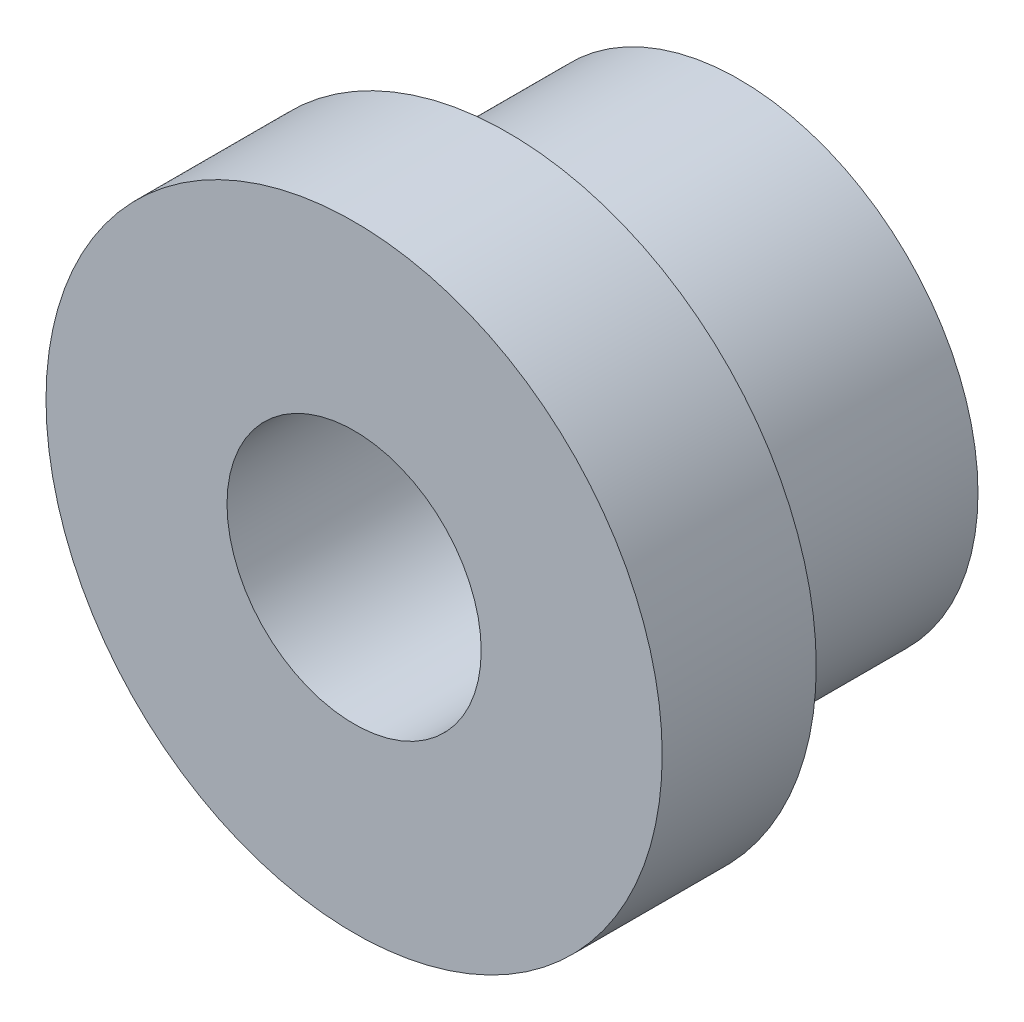
ISO-10303-21;
HEADER;
FILE_DESCRIPTION(('STEP AP214'),'2;1');
FILE_NAME('part.step','',(''),(''),'','','');
FILE_SCHEMA(('AUTOMOTIVE_DESIGN { 1 0 10303 214 1 1 1 1 }'));
ENDSEC;
DATA;
#1=APPLICATION_CONTEXT('core data for automotive mechanical design processes');
#2=APPLICATION_PROTOCOL_DEFINITION('international standard','automotive_design',2000,#1);
#3=PRODUCT_CONTEXT('',#1,'mechanical');
#4=PRODUCT('Part','Part','',(#3));
#5=PRODUCT_RELATED_PRODUCT_CATEGORY('part','',(#4));
#6=PRODUCT_DEFINITION_FORMATION('','',#4);
#7=PRODUCT_DEFINITION_CONTEXT('part definition',#1,'design');
#8=PRODUCT_DEFINITION('design','',#6,#7);
#9=PRODUCT_DEFINITION_SHAPE('','',#8);
#10=(LENGTH_UNIT() NAMED_UNIT(*) SI_UNIT(.MILLI.,.METRE.));
#11=(NAMED_UNIT(*) PLANE_ANGLE_UNIT() SI_UNIT($,.RADIAN.));
#12=(NAMED_UNIT(*) SI_UNIT($,.STERADIAN.) SOLID_ANGLE_UNIT());
#13=UNCERTAINTY_MEASURE_WITH_UNIT(LENGTH_MEASURE(1.E-05),#10,'distance_accuracy_value','');
#14=(GEOMETRIC_REPRESENTATION_CONTEXT(3) GLOBAL_UNCERTAINTY_ASSIGNED_CONTEXT((#13)) GLOBAL_UNIT_ASSIGNED_CONTEXT((#10,
#11,#12)) REPRESENTATION_CONTEXT('',''));
#15=CARTESIAN_POINT('',(0.,0.,0.));
#16=DIRECTION('',(0.,0.,1.));
#17=DIRECTION('',(1.,0.,0.));
#18=AXIS2_PLACEMENT_3D('',#15,#16,#17);
#19=CARTESIAN_POINT('',(0.,0.,0.));
#20=DIRECTION('',(0.,0.,1.));
#21=DIRECTION('',(1.,0.,0.));
#22=AXIS2_PLACEMENT_3D('',#19,#20,#21);
#23=PLANE('',#22);
#24=CARTESIAN_POINT('',(0.,0.,0.));
#25=DIRECTION('',(0.,0.,1.));
#26=DIRECTION('',(1.,0.,0.));
#27=AXIS2_PLACEMENT_3D('',#24,#25,#26);
#28=CIRCLE('',#27,3.1);
#29=CARTESIAN_POINT('',(3.1,0.,0.));
#30=VERTEX_POINT('',#29);
#31=EDGE_CURVE('E43',#30,#30,#28,.T.);
#32=ORIENTED_EDGE('',*,*,#31,.F.);
#33=EDGE_LOOP('',(#32));
#34=FACE_BOUND('',#33,.T.);
#35=CARTESIAN_POINT('',(0.,0.,0.));
#36=DIRECTION('',(0.,0.,1.));
#37=DIRECTION('',(1.,0.,0.));
#38=AXIS2_PLACEMENT_3D('',#35,#36,#37);
#39=CIRCLE('',#38,1.65);
#40=CARTESIAN_POINT('',(1.65,0.,0.));
#41=VERTEX_POINT('',#40);
#42=EDGE_CURVE('E49',#41,#41,#39,.T.);
#43=ORIENTED_EDGE('',*,*,#42,.T.);
#44=EDGE_LOOP('',(#43));
#45=FACE_BOUND('',#44,.T.);
#46=ADVANCED_FACE('F39',(#34,#45),#23,.F.);
#47=CARTESIAN_POINT('',(0.,0.,3.));
#48=DIRECTION('',(0.,0.,-1.));
#49=DIRECTION('',(-1.,0.,0.));
#50=AXIS2_PLACEMENT_3D('',#47,#48,#49);
#51=CYLINDRICAL_SURFACE('',#50,3.1);
#52=CARTESIAN_POINT('',(0.,0.,3.));
#53=DIRECTION('',(0.,0.,1.));
#54=DIRECTION('',(1.,0.,0.));
#55=AXIS2_PLACEMENT_3D('',#52,#53,#54);
#56=CIRCLE('',#55,3.1);
#57=CARTESIAN_POINT('',(3.1,0.,3.));
#58=VERTEX_POINT('',#57);
#59=EDGE_CURVE('E10',#58,#58,#56,.T.);
#60=ORIENTED_EDGE('',*,*,#59,.F.);
#61=EDGE_LOOP('',(#60));
#62=FACE_BOUND('',#61,.T.);
#63=ORIENTED_EDGE('',*,*,#31,.T.);
#64=EDGE_LOOP('',(#63));
#65=FACE_BOUND('',#64,.T.);
#66=ADVANCED_FACE('F41',(#62,#65),#51,.T.);
#67=CARTESIAN_POINT('',(0.,0.,3.));
#68=DIRECTION('',(0.,0.,-1.));
#69=DIRECTION('',(-1.,0.,0.));
#70=AXIS2_PLACEMENT_3D('',#67,#68,#69);
#71=CYLINDRICAL_SURFACE('',#70,1.65);
#72=ORIENTED_EDGE('',*,*,#42,.F.);
#73=EDGE_LOOP('',(#72));
#74=FACE_BOUND('',#73,.T.);
#75=CARTESIAN_POINT('',(0.,0.,5.));
#76=DIRECTION('',(0.,0.,1.));
#77=DIRECTION('',(1.,0.,0.));
#78=AXIS2_PLACEMENT_3D('',#75,#76,#77);
#79=CIRCLE('',#78,1.65);
#80=CARTESIAN_POINT('',(1.65,0.,5.));
#81=VERTEX_POINT('',#80);
#82=EDGE_CURVE('E59',#81,#81,#79,.T.);
#83=ORIENTED_EDGE('',*,*,#82,.T.);
#84=EDGE_LOOP('',(#83));
#85=FACE_BOUND('',#84,.T.);
#86=ADVANCED_FACE('F62',(#74,#85),#71,.F.);
#87=CARTESIAN_POINT('',(0.,0.,5.));
#88=DIRECTION('',(0.,0.,1.));
#89=DIRECTION('',(1.,0.,0.));
#90=AXIS2_PLACEMENT_3D('',#87,#88,#89);
#91=PLANE('',#90);
#92=CARTESIAN_POINT('',(0.,0.,5.));
#93=DIRECTION('',(0.,0.,1.));
#94=DIRECTION('',(1.,0.,0.));
#95=AXIS2_PLACEMENT_3D('',#92,#93,#94);
#96=CIRCLE('',#95,4.);
#97=CARTESIAN_POINT('',(4.,0.,5.));
#98=VERTEX_POINT('',#97);
#99=EDGE_CURVE('E53',#98,#98,#96,.T.);
#100=ORIENTED_EDGE('',*,*,#99,.T.);
#101=EDGE_LOOP('',(#100));
#102=FACE_BOUND('',#101,.T.);
#103=ORIENTED_EDGE('',*,*,#82,.F.);
#104=EDGE_LOOP('',(#103));
#105=FACE_BOUND('',#104,.T.);
#106=ADVANCED_FACE('F67',(#102,#105),#91,.T.);
#107=CARTESIAN_POINT('',(0.,0.,3.));
#108=DIRECTION('',(0.,0.,1.));
#109=DIRECTION('',(1.,0.,0.));
#110=AXIS2_PLACEMENT_3D('',#107,#108,#109);
#111=PLANE('',#110);
#112=ORIENTED_EDGE('',*,*,#59,.T.);
#113=EDGE_LOOP('',(#112));
#114=FACE_BOUND('',#113,.T.);
#115=CARTESIAN_POINT('',(0.,0.,3.));
#116=DIRECTION('',(0.,0.,1.));
#117=DIRECTION('',(1.,0.,0.));
#118=AXIS2_PLACEMENT_3D('',#115,#116,#117);
#119=CIRCLE('',#118,4.);
#120=CARTESIAN_POINT('',(4.,0.,3.));
#121=VERTEX_POINT('',#120);
#122=EDGE_CURVE('E54',#121,#121,#119,.T.);
#123=ORIENTED_EDGE('',*,*,#122,.F.);
#124=EDGE_LOOP('',(#123));
#125=FACE_BOUND('',#124,.T.);
#126=ADVANCED_FACE('F66',(#114,#125),#111,.F.);
#127=CARTESIAN_POINT('',(0.,0.,5.));
#128=DIRECTION('',(0.,0.,-1.));
#129=DIRECTION('',(-1.,0.,0.));
#130=AXIS2_PLACEMENT_3D('',#127,#128,#129);
#131=CYLINDRICAL_SURFACE('',#130,4.);
#132=ORIENTED_EDGE('',*,*,#99,.F.);
#133=EDGE_LOOP('',(#132));
#134=FACE_BOUND('',#133,.T.);
#135=ORIENTED_EDGE('',*,*,#122,.T.);
#136=EDGE_LOOP('',(#135));
#137=FACE_BOUND('',#136,.T.);
#138=ADVANCED_FACE('F74',(#134,#137),#131,.T.);
#139=CLOSED_SHELL('',(#46,#66,#86,#106,#126,#138));
#140=MANIFOLD_SOLID_BREP('B2',#139);
#141=ADVANCED_BREP_SHAPE_REPRESENTATION('',(#18,#140),#14);
#142=SHAPE_DEFINITION_REPRESENTATION(#9,#141);
ENDSEC;
END-ISO-10303-21;
